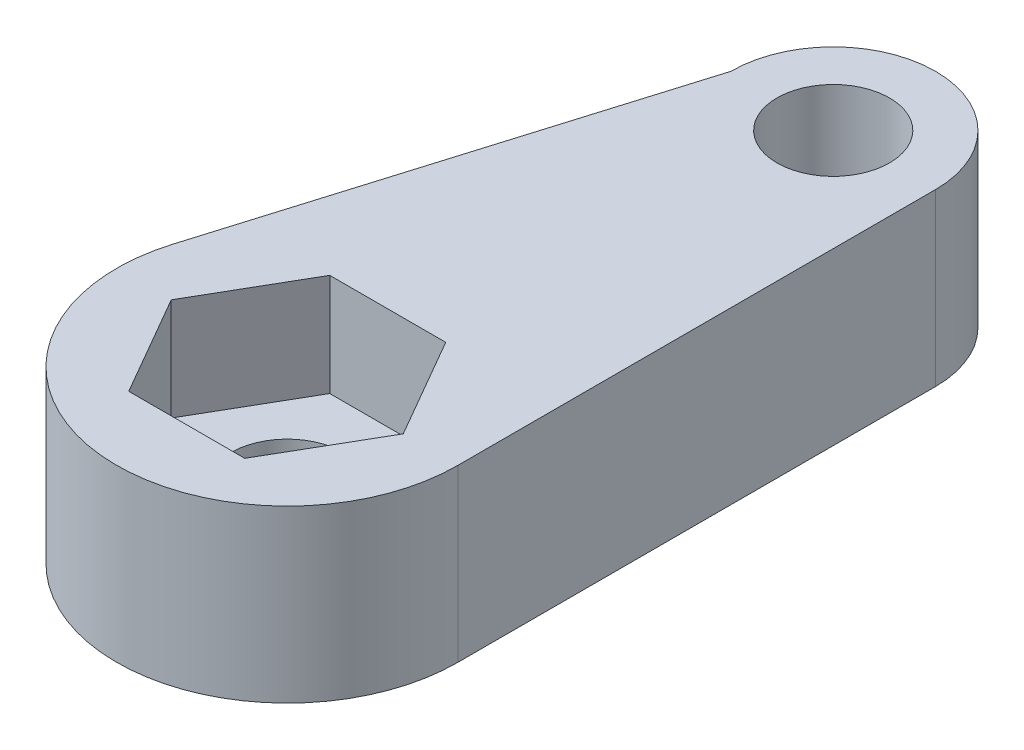
ISO-10303-21;
HEADER;
FILE_DESCRIPTION(('STEP AP214'),'2;1');
FILE_NAME('part.step','',(''),(''),'','','');
FILE_SCHEMA(('AUTOMOTIVE_DESIGN { 1 0 10303 214 1 1 1 1 }'));
ENDSEC;
DATA;
#1=APPLICATION_CONTEXT('core data for automotive mechanical design processes');
#2=APPLICATION_PROTOCOL_DEFINITION('international standard','automotive_design',2000,#1);
#3=PRODUCT_CONTEXT('',#1,'mechanical');
#4=PRODUCT('Part','Part','',(#3));
#5=PRODUCT_RELATED_PRODUCT_CATEGORY('part','',(#4));
#6=PRODUCT_DEFINITION_FORMATION('','',#4);
#7=PRODUCT_DEFINITION_CONTEXT('part definition',#1,'design');
#8=PRODUCT_DEFINITION('design','',#6,#7);
#9=PRODUCT_DEFINITION_SHAPE('','',#8);
#10=(LENGTH_UNIT() NAMED_UNIT(*) SI_UNIT(.MILLI.,.METRE.));
#11=(NAMED_UNIT(*) PLANE_ANGLE_UNIT() SI_UNIT($,.RADIAN.));
#12=(NAMED_UNIT(*) SI_UNIT($,.STERADIAN.) SOLID_ANGLE_UNIT());
#13=UNCERTAINTY_MEASURE_WITH_UNIT(LENGTH_MEASURE(1.E-05),#10,'distance_accuracy_value','');
#14=(GEOMETRIC_REPRESENTATION_CONTEXT(3) GLOBAL_UNCERTAINTY_ASSIGNED_CONTEXT((#13)) GLOBAL_UNIT_ASSIGNED_CONTEXT((#10,
#11,#12)) REPRESENTATION_CONTEXT('',''));
#15=CARTESIAN_POINT('',(0.,0.,0.));
#16=DIRECTION('',(0.,0.,1.));
#17=DIRECTION('',(1.,0.,0.));
#18=AXIS2_PLACEMENT_3D('',#15,#16,#17);
#19=CARTESIAN_POINT('',(-0.123874335291325,5.,6.35195282016352));
#20=DIRECTION('',(0.,-1.,0.));
#21=DIRECTION('',(0.,0.,-1.));
#22=AXIS2_PLACEMENT_3D('',#19,#20,#21);
#23=CYLINDRICAL_SURFACE('',#22,1.64999999999018);
#24=CARTESIAN_POINT('',(-0.123874335291325,0.,6.35195282016352));
#25=DIRECTION('',(0.,1.,0.));
#26=DIRECTION('',(0.,0.,1.));
#27=AXIS2_PLACEMENT_3D('',#24,#25,#26);
#28=CIRCLE('',#27,1.64999999999018);
#29=CARTESIAN_POINT('',(-0.123874335291325,0.,8.0019528201537));
#30=VERTEX_POINT('',#29);
#31=EDGE_CURVE('E174',#30,#30,#28,.T.);
#32=ORIENTED_EDGE('',*,*,#31,.F.);
#33=EDGE_LOOP('',(#32));
#34=FACE_BOUND('',#33,.T.);
#35=CARTESIAN_POINT('',(-0.123874335291325,2.,6.35195282016352));
#36=DIRECTION('',(0.,1.,0.));
#37=DIRECTION('',(0.,0.,1.));
#38=AXIS2_PLACEMENT_3D('',#35,#36,#37);
#39=CIRCLE('',#38,1.64999999999018);
#40=CARTESIAN_POINT('',(-0.123874335291325,2.,8.0019528201537));
#41=VERTEX_POINT('',#40);
#42=EDGE_CURVE('E37',#41,#41,#39,.T.);
#43=ORIENTED_EDGE('',*,*,#42,.T.);
#44=EDGE_LOOP('',(#43));
#45=FACE_BOUND('',#44,.T.);
#46=ADVANCED_FACE('F33',(#34,#45),#23,.F.);
#47=CARTESIAN_POINT('',(-0.123874335291325,5.,6.35195282016352));
#48=DIRECTION('',(0.,1.,0.));
#49=DIRECTION('',(0.,0.,1.));
#50=AXIS2_PLACEMENT_3D('',#47,#48,#49);
#51=PLANE('',#50);
#52=DIRECTION('',(0.500204787317355,0.,-0.86590713748346));
#53=VECTOR('',#52,1.);
#54=CARTESIAN_POINT('',(1.57542934027331,5.,9.29684121612888));
#55=LINE('',#54,#53);
#56=CARTESIAN_POINT('',(1.57542934027331,5.,9.29684121612888));
#57=VERTEX_POINT('',#56);
#58=CARTESIAN_POINT('',(3.276125664707,5.,6.35275686636296));
#59=VERTEX_POINT('',#58);
#60=EDGE_CURVE('E49',#57,#59,#55,.T.);
#61=ORIENTED_EDGE('',*,*,#60,.F.);
#62=DIRECTION('',(0.999999972037618,0.,0.000236484169692373));
#63=VECTOR('',#62,1.);
#64=CARTESIAN_POINT('',(-1.82457065972502,5.,9.29603716992944));
#65=LINE('',#64,#63);
#66=CARTESIAN_POINT('',(-1.82457065972502,5.,9.29603716992944));
#67=VERTEX_POINT('',#66);
#68=EDGE_CURVE('E141',#67,#57,#65,.T.);
#69=ORIENTED_EDGE('',*,*,#68,.F.);
#70=DIRECTION('',(0.499795184720263,0.,0.866143621653152));
#71=VECTOR('',#70,1.);
#72=CARTESIAN_POINT('',(-3.52387433528965,5.,6.35114877396409));
#73=LINE('',#72,#71);
#74=CARTESIAN_POINT('',(-3.52387433528965,5.,6.35114877396409));
#75=VERTEX_POINT('',#74);
#76=EDGE_CURVE('E144',#75,#67,#73,.T.);
#77=ORIENTED_EDGE('',*,*,#76,.F.);
#78=DIRECTION('',(-0.500204787317355,0.,0.86590713748346));
#79=VECTOR('',#78,1.);
#80=CARTESIAN_POINT('',(-1.82317801085596,5.,3.40706442419816));
#81=LINE('',#80,#79);
#82=CARTESIAN_POINT('',(-1.82317801085596,5.,3.40706442419816));
#83=VERTEX_POINT('',#82);
#84=EDGE_CURVE('E160',#83,#75,#81,.T.);
#85=ORIENTED_EDGE('',*,*,#84,.F.);
#86=DIRECTION('',(-0.999999972037618,0.,-0.000236484169692118));
#87=VECTOR('',#86,1.);
#88=CARTESIAN_POINT('',(1.57682198914236,5.,3.4078684703976));
#89=LINE('',#88,#87);
#90=CARTESIAN_POINT('',(1.57682198914236,5.,3.4078684703976));
#91=VERTEX_POINT('',#90);
#92=EDGE_CURVE('E157',#91,#83,#89,.T.);
#93=ORIENTED_EDGE('',*,*,#92,.F.);
#94=DIRECTION('',(-0.499795184720264,0.,-0.866143621653151));
#95=VECTOR('',#94,1.);
#96=CARTESIAN_POINT('',(3.276125664707,5.,6.35275686636296));
#97=LINE('',#96,#95);
#98=EDGE_CURVE('E155',#59,#91,#97,.T.);
#99=ORIENTED_EDGE('',*,*,#98,.F.);
#100=EDGE_LOOP('',(#61,#69,#77,#85,#93,#99));
#101=FACE_BOUND('',#100,.T.);
#102=CARTESIAN_POINT('',(1.87612566470867,5.,-7.64724342024737));
#103=DIRECTION('',(0.,1.,0.));
#104=DIRECTION('',(0.,0.,1.));
#105=AXIS2_PLACEMENT_3D('',#102,#103,#104);
#106=CIRCLE('',#105,1.65);
#107=CARTESIAN_POINT('',(1.87612566470867,5.,-5.99724342024737));
#108=VERTEX_POINT('',#107);
#109=EDGE_CURVE('E178',#108,#108,#106,.T.);
#110=ORIENTED_EDGE('',*,*,#109,.F.);
#111=EDGE_LOOP('',(#110));
#112=FACE_BOUND('',#111,.T.);
#113=CARTESIAN_POINT('',(-0.123874335291325,5.,6.35195282016352));
#114=DIRECTION('',(0.,1.,0.));
#115=DIRECTION('',(0.,0.,1.));
#116=AXIS2_PLACEMENT_3D('',#113,#114,#115);
#117=CIRCLE('',#116,5.);
#118=CARTESIAN_POINT('',(-4.91086093196899,5.,4.90808325429949));
#119=VERTEX_POINT('',#118);
#120=CARTESIAN_POINT('',(4.87612566470867,5.,6.35195282016352));
#121=VERTEX_POINT('',#120);
#122=EDGE_CURVE('E184',#119,#121,#117,.T.);
#123=ORIENTED_EDGE('',*,*,#122,.T.);
#124=DIRECTION('',(0.,0.,-1.));
#125=VECTOR('',#124,1.);
#126=CARTESIAN_POINT('',(4.87612566470867,5.,-7.64724342024737));
#127=LINE('',#126,#125);
#128=CARTESIAN_POINT('',(4.87612566470867,5.,-7.64724342024737));
#129=VERTEX_POINT('',#128);
#130=EDGE_CURVE('E86',#121,#129,#127,.T.);
#131=ORIENTED_EDGE('',*,*,#130,.T.);
#132=CARTESIAN_POINT('',(1.87612566470867,5.,-7.64724342024737));
#133=DIRECTION('',(0.,1.,0.));
#134=DIRECTION('',(0.,0.,1.));
#135=AXIS2_PLACEMENT_3D('',#132,#133,#134);
#136=CIRCLE('',#135,3.);
#137=CARTESIAN_POINT('',(-1.12387433529133,5.,-7.64724342024737));
#138=VERTEX_POINT('',#137);
#139=EDGE_CURVE('E187',#129,#138,#136,.T.);
#140=ORIENTED_EDGE('',*,*,#139,.T.);
#141=DIRECTION('',(-0.288773913249242,0.,0.957397319312478));
#142=VECTOR('',#141,1.);
#143=CARTESIAN_POINT('',(-1.12387433529133,5.,-7.64724342024737));
#144=LINE('',#143,#142);
#145=EDGE_CURVE('E58',#138,#119,#144,.T.);
#146=ORIENTED_EDGE('',*,*,#145,.T.);
#147=EDGE_LOOP('',(#123,#131,#140,#146));
#148=FACE_BOUND('',#147,.T.);
#149=ADVANCED_FACE('F228',(#101,#112,#148),#51,.T.);
#150=CARTESIAN_POINT('',(-0.123874335291325,0.,6.35195282016352));
#151=DIRECTION('',(0.,1.,0.));
#152=DIRECTION('',(0.,0.,1.));
#153=AXIS2_PLACEMENT_3D('',#150,#151,#152);
#154=PLANE('',#153);
#155=CARTESIAN_POINT('',(-0.123874335291325,0.,6.35195282016352));
#156=DIRECTION('',(0.,1.,0.));
#157=DIRECTION('',(0.,0.,1.));
#158=AXIS2_PLACEMENT_3D('',#155,#156,#157);
#159=CIRCLE('',#158,5.);
#160=CARTESIAN_POINT('',(-4.91086093196899,0.,4.90808325429949));
#161=VERTEX_POINT('',#160);
#162=CARTESIAN_POINT('',(4.87612566470867,0.,6.35195282016352));
#163=VERTEX_POINT('',#162);
#164=EDGE_CURVE('E181',#161,#163,#159,.T.);
#165=ORIENTED_EDGE('',*,*,#164,.F.);
#166=DIRECTION('',(-0.288773913249242,0.,0.957397319312478));
#167=VECTOR('',#166,1.);
#168=CARTESIAN_POINT('',(-1.12387433529133,0.,-7.64724342024737));
#169=LINE('',#168,#167);
#170=CARTESIAN_POINT('',(-1.12387433529133,0.,-7.64724342024737));
#171=VERTEX_POINT('',#170);
#172=EDGE_CURVE('E79',#171,#161,#169,.T.);
#173=ORIENTED_EDGE('',*,*,#172,.F.);
#174=CARTESIAN_POINT('',(1.87612566470867,0.,-7.64724342024737));
#175=DIRECTION('',(0.,1.,0.));
#176=DIRECTION('',(0.,0.,1.));
#177=AXIS2_PLACEMENT_3D('',#174,#175,#176);
#178=CIRCLE('',#177,3.);
#179=CARTESIAN_POINT('',(4.87612566470867,0.,-7.64724342024737));
#180=VERTEX_POINT('',#179);
#181=EDGE_CURVE('E195',#180,#171,#178,.T.);
#182=ORIENTED_EDGE('',*,*,#181,.F.);
#183=DIRECTION('',(0.,0.,-1.));
#184=VECTOR('',#183,1.);
#185=CARTESIAN_POINT('',(4.87612566470867,0.,-7.64724342024737));
#186=LINE('',#185,#184);
#187=EDGE_CURVE('E193',#163,#180,#186,.T.);
#188=ORIENTED_EDGE('',*,*,#187,.F.);
#189=EDGE_LOOP('',(#165,#173,#182,#188));
#190=FACE_BOUND('',#189,.T.);
#191=CARTESIAN_POINT('',(1.87612566470867,0.,-7.64724342024737));
#192=DIRECTION('',(0.,1.,0.));
#193=DIRECTION('',(0.,0.,1.));
#194=AXIS2_PLACEMENT_3D('',#191,#192,#193);
#195=CIRCLE('',#194,1.65);
#196=CARTESIAN_POINT('',(1.87612566470867,0.,-5.99724342024737));
#197=VERTEX_POINT('',#196);
#198=EDGE_CURVE('E177',#197,#197,#195,.T.);
#199=ORIENTED_EDGE('',*,*,#198,.T.);
#200=EDGE_LOOP('',(#199));
#201=FACE_BOUND('',#200,.T.);
#202=ORIENTED_EDGE('',*,*,#31,.T.);
#203=EDGE_LOOP('',(#202));
#204=FACE_BOUND('',#203,.T.);
#205=ADVANCED_FACE('F209',(#190,#201,#204),#154,.F.);
#206=CARTESIAN_POINT('',(-0.123874335291325,5.,6.35195282016352));
#207=DIRECTION('',(0.,-1.,0.));
#208=DIRECTION('',(0.,0.,-1.));
#209=AXIS2_PLACEMENT_3D('',#206,#207,#208);
#210=CYLINDRICAL_SURFACE('',#209,5.);
#211=ORIENTED_EDGE('',*,*,#164,.T.);
#212=DIRECTION('',(0.,-1.,0.));
#213=VECTOR('',#212,1.);
#214=CARTESIAN_POINT('',(4.87612566470867,5.,6.35195282016352));
#215=LINE('',#214,#213);
#216=EDGE_CURVE('E11',#121,#163,#215,.T.);
#217=ORIENTED_EDGE('',*,*,#216,.F.);
#218=ORIENTED_EDGE('',*,*,#122,.F.);
#219=DIRECTION('',(0.,-1.,0.));
#220=VECTOR('',#219,1.);
#221=CARTESIAN_POINT('',(-4.91086093196899,5.,4.90808325429949));
#222=LINE('',#221,#220);
#223=EDGE_CURVE('E190',#119,#161,#222,.T.);
#224=ORIENTED_EDGE('',*,*,#223,.T.);
#225=EDGE_LOOP('',(#211,#217,#218,#224));
#226=FACE_BOUND('',#225,.T.);
#227=ADVANCED_FACE('F35',(#226),#210,.T.);
#228=CARTESIAN_POINT('',(4.87612566470867,5.,-7.64724342024737));
#229=DIRECTION('',(-1.,0.,0.));
#230=DIRECTION('',(0.,0.,1.));
#231=AXIS2_PLACEMENT_3D('',#228,#229,#230);
#232=PLANE('',#231);
#233=ORIENTED_EDGE('',*,*,#187,.T.);
#234=DIRECTION('',(0.,-1.,0.));
#235=VECTOR('',#234,1.);
#236=CARTESIAN_POINT('',(4.87612566470867,5.,-7.64724342024737));
#237=LINE('',#236,#235);
#238=EDGE_CURVE('E42',#129,#180,#237,.T.);
#239=ORIENTED_EDGE('',*,*,#238,.F.);
#240=ORIENTED_EDGE('',*,*,#130,.F.);
#241=ORIENTED_EDGE('',*,*,#216,.T.);
#242=EDGE_LOOP('',(#233,#239,#240,#241));
#243=FACE_BOUND('',#242,.T.);
#244=ADVANCED_FACE('F224',(#243),#232,.F.);
#245=CARTESIAN_POINT('',(1.87612566470867,5.,-7.64724342024737));
#246=DIRECTION('',(0.,-1.,0.));
#247=DIRECTION('',(0.,0.,-1.));
#248=AXIS2_PLACEMENT_3D('',#245,#246,#247);
#249=CYLINDRICAL_SURFACE('',#248,3.);
#250=ORIENTED_EDGE('',*,*,#181,.T.);
#251=DIRECTION('',(0.,-1.,0.));
#252=VECTOR('',#251,1.);
#253=CARTESIAN_POINT('',(-1.12387433529133,5.,-7.64724342024737));
#254=LINE('',#253,#252);
#255=EDGE_CURVE('E199',#138,#171,#254,.T.);
#256=ORIENTED_EDGE('',*,*,#255,.F.);
#257=ORIENTED_EDGE('',*,*,#139,.F.);
#258=ORIENTED_EDGE('',*,*,#238,.T.);
#259=EDGE_LOOP('',(#250,#256,#257,#258));
#260=FACE_BOUND('',#259,.T.);
#261=ADVANCED_FACE('F205',(#260),#249,.T.);
#262=CARTESIAN_POINT('',(-1.12387433529133,5.,-7.64724342024737));
#263=DIRECTION('',(0.957397319312478,0.,0.288773913249242));
#264=DIRECTION('',(0.288773913249242,0.,-0.957397319312478));
#265=AXIS2_PLACEMENT_3D('',#262,#263,#264);
#266=PLANE('',#265);
#267=ORIENTED_EDGE('',*,*,#172,.T.);
#268=ORIENTED_EDGE('',*,*,#223,.F.);
#269=ORIENTED_EDGE('',*,*,#145,.F.);
#270=ORIENTED_EDGE('',*,*,#255,.T.);
#271=EDGE_LOOP('',(#267,#268,#269,#270));
#272=FACE_BOUND('',#271,.T.);
#273=ADVANCED_FACE('F214',(#272),#266,.F.);
#274=CARTESIAN_POINT('',(1.87612566470867,5.,-7.64724342024737));
#275=DIRECTION('',(0.,-1.,0.));
#276=DIRECTION('',(0.,0.,-1.));
#277=AXIS2_PLACEMENT_3D('',#274,#275,#276);
#278=CYLINDRICAL_SURFACE('',#277,1.65);
#279=ORIENTED_EDGE('',*,*,#109,.T.);
#280=EDGE_LOOP('',(#279));
#281=FACE_BOUND('',#280,.T.);
#282=ORIENTED_EDGE('',*,*,#198,.F.);
#283=EDGE_LOOP('',(#282));
#284=FACE_BOUND('',#283,.T.);
#285=ADVANCED_FACE('F216',(#281,#284),#278,.F.);
#286=CARTESIAN_POINT('',(1.57542934027331,2.,9.29684121612888));
#287=DIRECTION('',(0.86590713748346,0.,0.500204787317355));
#288=DIRECTION('',(0.500204787317355,0.,-0.86590713748346));
#289=AXIS2_PLACEMENT_3D('',#286,#287,#288);
#290=PLANE('',#289);
#291=ORIENTED_EDGE('',*,*,#60,.T.);
#292=DIRECTION('',(0.,1.,0.));
#293=VECTOR('',#292,1.);
#294=CARTESIAN_POINT('',(3.276125664707,2.,6.35275686636296));
#295=LINE('',#294,#293);
#296=CARTESIAN_POINT('',(3.276125664707,2.,6.35275686636296));
#297=VERTEX_POINT('',#296);
#298=EDGE_CURVE('E118',#297,#59,#295,.T.);
#299=ORIENTED_EDGE('',*,*,#298,.F.);
#300=DIRECTION('',(0.500204787317355,0.,-0.86590713748346));
#301=VECTOR('',#300,1.);
#302=CARTESIAN_POINT('',(1.57542934027331,2.,9.29684121612888));
#303=LINE('',#302,#301);
#304=CARTESIAN_POINT('',(1.57542934027331,2.,9.29684121612888));
#305=VERTEX_POINT('',#304);
#306=EDGE_CURVE('E122',#305,#297,#303,.T.);
#307=ORIENTED_EDGE('',*,*,#306,.F.);
#308=DIRECTION('',(0.,1.,0.));
#309=VECTOR('',#308,1.);
#310=CARTESIAN_POINT('',(1.57542934027331,2.,9.29684121612888));
#311=LINE('',#310,#309);
#312=EDGE_CURVE('E165',#305,#57,#311,.T.);
#313=ORIENTED_EDGE('',*,*,#312,.T.);
#314=EDGE_LOOP('',(#291,#299,#307,#313));
#315=FACE_BOUND('',#314,.T.);
#316=ADVANCED_FACE('F120',(#315),#290,.F.);
#317=CARTESIAN_POINT('',(-1.82457065972502,2.,9.29603716992944));
#318=DIRECTION('',(-0.000236484169692373,0.,0.999999972037618));
#319=DIRECTION('',(0.999999972037618,0.,0.000236484169692373));
#320=AXIS2_PLACEMENT_3D('',#317,#318,#319);
#321=PLANE('',#320);
#322=ORIENTED_EDGE('',*,*,#68,.T.);
#323=ORIENTED_EDGE('',*,*,#312,.F.);
#324=DIRECTION('',(0.999999972037618,0.,0.000236484169692373));
#325=VECTOR('',#324,1.);
#326=CARTESIAN_POINT('',(-1.82457065972502,2.,9.29603716992944));
#327=LINE('',#326,#325);
#328=CARTESIAN_POINT('',(-1.82457065972502,2.,9.29603716992944));
#329=VERTEX_POINT('',#328);
#330=EDGE_CURVE('E128',#329,#305,#327,.T.);
#331=ORIENTED_EDGE('',*,*,#330,.F.);
#332=DIRECTION('',(0.,1.,0.));
#333=VECTOR('',#332,1.);
#334=CARTESIAN_POINT('',(-1.82457065972502,2.,9.29603716992944));
#335=LINE('',#334,#333);
#336=EDGE_CURVE('E167',#329,#67,#335,.T.);
#337=ORIENTED_EDGE('',*,*,#336,.T.);
#338=EDGE_LOOP('',(#322,#323,#331,#337));
#339=FACE_BOUND('',#338,.T.);
#340=ADVANCED_FACE('F283',(#339),#321,.F.);
#341=CARTESIAN_POINT('',(-3.52387433528965,2.,6.35114877396409));
#342=DIRECTION('',(-0.866143621653152,0.,0.499795184720263));
#343=DIRECTION('',(0.499795184720263,0.,0.866143621653152));
#344=AXIS2_PLACEMENT_3D('',#341,#342,#343);
#345=PLANE('',#344);
#346=ORIENTED_EDGE('',*,*,#76,.T.);
#347=ORIENTED_EDGE('',*,*,#336,.F.);
#348=DIRECTION('',(0.499795184720263,0.,0.866143621653152));
#349=VECTOR('',#348,1.);
#350=CARTESIAN_POINT('',(-3.52387433528965,2.,6.35114877396409));
#351=LINE('',#350,#349);
#352=CARTESIAN_POINT('',(-3.52387433528965,2.,6.35114877396409));
#353=VERTEX_POINT('',#352);
#354=EDGE_CURVE('E151',#353,#329,#351,.T.);
#355=ORIENTED_EDGE('',*,*,#354,.F.);
#356=DIRECTION('',(0.,1.,0.));
#357=VECTOR('',#356,1.);
#358=CARTESIAN_POINT('',(-3.52387433528965,2.,6.35114877396409));
#359=LINE('',#358,#357);
#360=EDGE_CURVE('E169',#353,#75,#359,.T.);
#361=ORIENTED_EDGE('',*,*,#360,.T.);
#362=EDGE_LOOP('',(#346,#347,#355,#361));
#363=FACE_BOUND('',#362,.T.);
#364=ADVANCED_FACE('F291',(#363),#345,.F.);
#365=CARTESIAN_POINT('',(-1.82317801085596,2.,3.40706442419816));
#366=DIRECTION('',(-0.86590713748346,0.,-0.500204787317355));
#367=DIRECTION('',(-0.500204787317355,0.,0.86590713748346));
#368=AXIS2_PLACEMENT_3D('',#365,#366,#367);
#369=PLANE('',#368);
#370=ORIENTED_EDGE('',*,*,#84,.T.);
#371=ORIENTED_EDGE('',*,*,#360,.F.);
#372=DIRECTION('',(-0.500204787317355,0.,0.86590713748346));
#373=VECTOR('',#372,1.);
#374=CARTESIAN_POINT('',(-1.82317801085596,2.,3.40706442419816));
#375=LINE('',#374,#373);
#376=CARTESIAN_POINT('',(-1.82317801085596,2.,3.40706442419816));
#377=VERTEX_POINT('',#376);
#378=EDGE_CURVE('E148',#377,#353,#375,.T.);
#379=ORIENTED_EDGE('',*,*,#378,.F.);
#380=DIRECTION('',(0.,1.,0.));
#381=VECTOR('',#380,1.);
#382=CARTESIAN_POINT('',(-1.82317801085596,2.,3.40706442419816));
#383=LINE('',#382,#381);
#384=EDGE_CURVE('E171',#377,#83,#383,.T.);
#385=ORIENTED_EDGE('',*,*,#384,.T.);
#386=EDGE_LOOP('',(#370,#371,#379,#385));
#387=FACE_BOUND('',#386,.T.);
#388=ADVANCED_FACE('F301',(#387),#369,.F.);
#389=CARTESIAN_POINT('',(1.57682198914236,2.,3.4078684703976));
#390=DIRECTION('',(0.000236484169692118,0.,-0.999999972037618));
#391=DIRECTION('',(-0.999999972037618,0.,-0.000236484169692119));
#392=AXIS2_PLACEMENT_3D('',#389,#390,#391);
#393=PLANE('',#392);
#394=ORIENTED_EDGE('',*,*,#92,.T.);
#395=ORIENTED_EDGE('',*,*,#384,.F.);
#396=DIRECTION('',(-0.999999972037618,0.,-0.000236484169692118));
#397=VECTOR('',#396,1.);
#398=CARTESIAN_POINT('',(1.57682198914236,2.,3.4078684703976));
#399=LINE('',#398,#397);
#400=CARTESIAN_POINT('',(1.57682198914236,2.,3.4078684703976));
#401=VERTEX_POINT('',#400);
#402=EDGE_CURVE('E136',#401,#377,#399,.T.);
#403=ORIENTED_EDGE('',*,*,#402,.F.);
#404=DIRECTION('',(0.,1.,0.));
#405=VECTOR('',#404,1.);
#406=CARTESIAN_POINT('',(1.57682198914236,2.,3.4078684703976));
#407=LINE('',#406,#405);
#408=EDGE_CURVE('E127',#401,#91,#407,.T.);
#409=ORIENTED_EDGE('',*,*,#408,.T.);
#410=EDGE_LOOP('',(#394,#395,#403,#409));
#411=FACE_BOUND('',#410,.T.);
#412=ADVANCED_FACE('F311',(#411),#393,.F.);
#413=CARTESIAN_POINT('',(3.276125664707,2.,6.35275686636296));
#414=DIRECTION('',(0.866143621653151,0.,-0.499795184720264));
#415=DIRECTION('',(-0.499795184720264,0.,-0.866143621653151));
#416=AXIS2_PLACEMENT_3D('',#413,#414,#415);
#417=PLANE('',#416);
#418=ORIENTED_EDGE('',*,*,#98,.T.);
#419=ORIENTED_EDGE('',*,*,#408,.F.);
#420=DIRECTION('',(-0.499795184720264,0.,-0.866143621653151));
#421=VECTOR('',#420,1.);
#422=CARTESIAN_POINT('',(3.276125664707,2.,6.35275686636296));
#423=LINE('',#422,#421);
#424=EDGE_CURVE('E131',#297,#401,#423,.T.);
#425=ORIENTED_EDGE('',*,*,#424,.F.);
#426=ORIENTED_EDGE('',*,*,#298,.T.);
#427=EDGE_LOOP('',(#418,#419,#425,#426));
#428=FACE_BOUND('',#427,.T.);
#429=ADVANCED_FACE('F132',(#428),#417,.F.);
#430=CARTESIAN_POINT('',(0.,2.,0.));
#431=DIRECTION('',(0.,1.,0.));
#432=DIRECTION('',(0.,0.,1.));
#433=AXIS2_PLACEMENT_3D('',#430,#431,#432);
#434=PLANE('',#433);
#435=ORIENTED_EDGE('',*,*,#42,.F.);
#436=EDGE_LOOP('',(#435));
#437=FACE_BOUND('',#436,.T.);
#438=ORIENTED_EDGE('',*,*,#306,.T.);
#439=ORIENTED_EDGE('',*,*,#424,.T.);
#440=ORIENTED_EDGE('',*,*,#402,.T.);
#441=ORIENTED_EDGE('',*,*,#378,.T.);
#442=ORIENTED_EDGE('',*,*,#354,.T.);
#443=ORIENTED_EDGE('',*,*,#330,.T.);
#444=EDGE_LOOP('',(#438,#439,#440,#441,#442,#443));
#445=FACE_BOUND('',#444,.T.);
#446=ADVANCED_FACE('F138',(#437,#445),#434,.T.);
#447=CLOSED_SHELL('',(#46,#149,#205,#227,#244,#261,#273,#285,#316,#340,#364,#388,#412,#429,#446));
#448=MANIFOLD_SOLID_BREP('B2',#447);
#449=ADVANCED_BREP_SHAPE_REPRESENTATION('',(#18,#448),#14);
#450=SHAPE_DEFINITION_REPRESENTATION(#9,#449);
ENDSEC;
END-ISO-10303-21;
